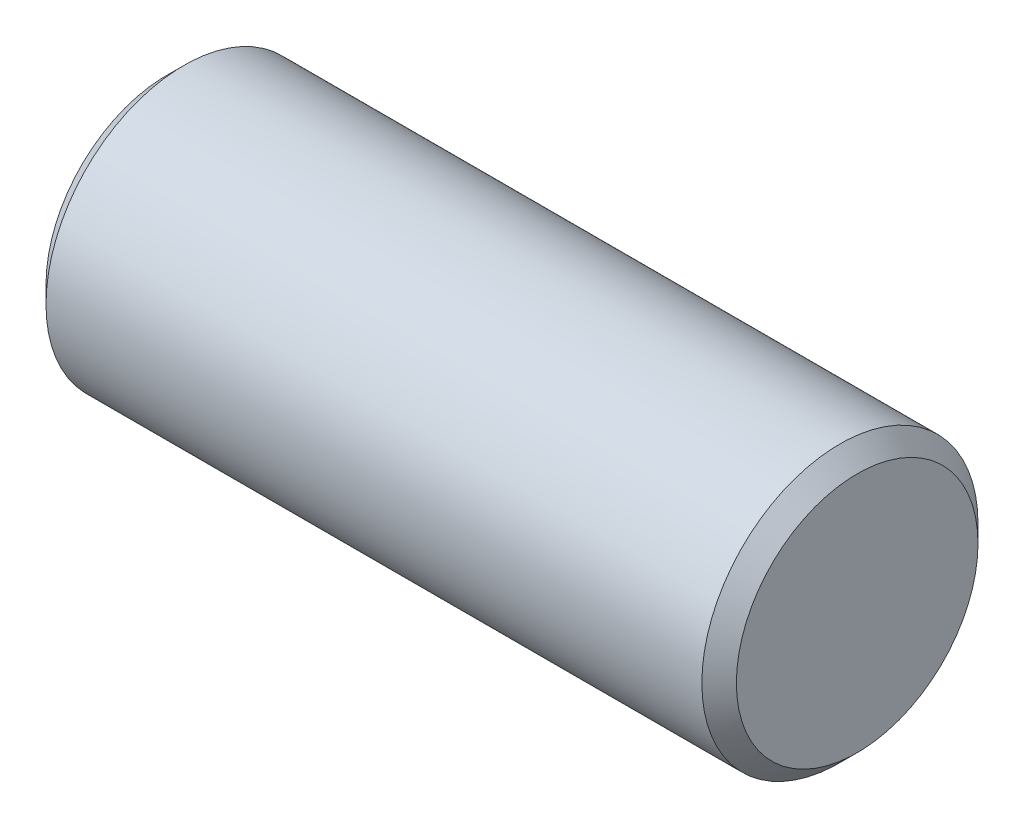
ISO-10303-21;
HEADER;
FILE_DESCRIPTION(('STEP AP214'),'2;1');
FILE_NAME('part.step','',(''),(''),'','','');
FILE_SCHEMA(('AUTOMOTIVE_DESIGN { 1 0 10303 214 1 1 1 1 }'));
ENDSEC;
DATA;
#1=APPLICATION_CONTEXT('core data for automotive mechanical design processes');
#2=APPLICATION_PROTOCOL_DEFINITION('international standard','automotive_design',2000,#1);
#3=PRODUCT_CONTEXT('',#1,'mechanical');
#4=PRODUCT('Part','Part','',(#3));
#5=PRODUCT_RELATED_PRODUCT_CATEGORY('part','',(#4));
#6=PRODUCT_DEFINITION_FORMATION('','',#4);
#7=PRODUCT_DEFINITION_CONTEXT('part definition',#1,'design');
#8=PRODUCT_DEFINITION('design','',#6,#7);
#9=PRODUCT_DEFINITION_SHAPE('','',#8);
#10=(LENGTH_UNIT() NAMED_UNIT(*) SI_UNIT(.MILLI.,.METRE.));
#11=(NAMED_UNIT(*) PLANE_ANGLE_UNIT() SI_UNIT($,.RADIAN.));
#12=(NAMED_UNIT(*) SI_UNIT($,.STERADIAN.) SOLID_ANGLE_UNIT());
#13=UNCERTAINTY_MEASURE_WITH_UNIT(LENGTH_MEASURE(1.E-05),#10,'distance_accuracy_value','');
#14=(GEOMETRIC_REPRESENTATION_CONTEXT(3) GLOBAL_UNCERTAINTY_ASSIGNED_CONTEXT((#13)) GLOBAL_UNIT_ASSIGNED_CONTEXT((#10,
#11,#12)) REPRESENTATION_CONTEXT('',''));
#15=CARTESIAN_POINT('',(0.,0.,0.));
#16=DIRECTION('',(0.,0.,1.));
#17=DIRECTION('',(1.,0.,0.));
#18=AXIS2_PLACEMENT_3D('',#15,#16,#17);
#19=CARTESIAN_POINT('',(0.,4.,0.));
#20=DIRECTION('',(1.,0.,0.));
#21=DIRECTION('',(0.,0.,-1.));
#22=AXIS2_PLACEMENT_3D('',#19,#20,#21);
#23=PLANE('',#22);
#24=CARTESIAN_POINT('',(0.,0.,0.));
#25=DIRECTION('',(1.,0.,0.));
#26=DIRECTION('',(0.,0.,-1.));
#27=AXIS2_PLACEMENT_3D('',#24,#25,#26);
#28=CIRCLE('',#27,3.5);
#29=CARTESIAN_POINT('',(0.,0.,-3.5));
#30=VERTEX_POINT('',#29);
#31=EDGE_CURVE('E47',#30,#30,#28,.F.);
#32=ORIENTED_EDGE('',*,*,#31,.T.);
#33=EDGE_LOOP('',(#32));
#34=FACE_BOUND('',#33,.T.);
#35=ADVANCED_FACE('F32',(#34),#23,.F.);
#36=CARTESIAN_POINT('',(20.,0.,0.));
#37=DIRECTION('',(-1.,0.,0.));
#38=DIRECTION('',(0.,0.,1.));
#39=AXIS2_PLACEMENT_3D('',#36,#37,#38);
#40=PLANE('',#39);
#41=CARTESIAN_POINT('',(20.,0.,0.));
#42=DIRECTION('',(-1.,0.,0.));
#43=DIRECTION('',(0.,0.,1.));
#44=AXIS2_PLACEMENT_3D('',#41,#42,#43);
#45=CIRCLE('',#44,3.49999999999998);
#46=CARTESIAN_POINT('',(20.,0.,3.49999999999998));
#47=VERTEX_POINT('',#46);
#48=EDGE_CURVE('E10',#47,#47,#45,.F.);
#49=ORIENTED_EDGE('',*,*,#48,.T.);
#50=EDGE_LOOP('',(#49));
#51=FACE_BOUND('',#50,.T.);
#52=ADVANCED_FACE('F63',(#51),#40,.F.);
#53=CARTESIAN_POINT('',(0.,0.,0.));
#54=DIRECTION('',(-1.,0.,0.));
#55=DIRECTION('',(0.,0.,1.));
#56=AXIS2_PLACEMENT_3D('',#53,#54,#55);
#57=CYLINDRICAL_SURFACE('',#56,3.99999999999999);
#58=CARTESIAN_POINT('',(0.499999999999992,0.,0.));
#59=DIRECTION('',(1.,0.,0.));
#60=DIRECTION('',(0.,0.,-1.));
#61=AXIS2_PLACEMENT_3D('',#58,#59,#60);
#62=CIRCLE('',#61,3.99999999999999);
#63=CARTESIAN_POINT('',(0.499999999999992,0.,-3.99999999999999));
#64=VERTEX_POINT('',#63);
#65=EDGE_CURVE('E39',#64,#64,#62,.T.);
#66=ORIENTED_EDGE('',*,*,#65,.T.);
#67=EDGE_LOOP('',(#66));
#68=FACE_BOUND('',#67,.T.);
#69=CARTESIAN_POINT('',(19.5,0.,0.));
#70=DIRECTION('',(-1.,0.,0.));
#71=DIRECTION('',(0.,0.,1.));
#72=AXIS2_PLACEMENT_3D('',#69,#70,#71);
#73=CIRCLE('',#72,3.99999999999999);
#74=CARTESIAN_POINT('',(19.5,0.,3.99999999999999));
#75=VERTEX_POINT('',#74);
#76=EDGE_CURVE('E43',#75,#75,#73,.T.);
#77=ORIENTED_EDGE('',*,*,#76,.T.);
#78=EDGE_LOOP('',(#77));
#79=FACE_BOUND('',#78,.T.);
#80=ADVANCED_FACE('F56',(#68,#79),#57,.T.);
#81=CARTESIAN_POINT('',(0.,0.,0.));
#82=DIRECTION('',(1.,0.,0.));
#83=DIRECTION('',(0.,0.,-1.));
#84=AXIS2_PLACEMENT_3D('',#81,#82,#83);
#85=CONICAL_SURFACE('',#84,3.5,0.785398163397445);
#86=ORIENTED_EDGE('',*,*,#65,.F.);
#87=EDGE_LOOP('',(#86));
#88=FACE_BOUND('',#87,.T.);
#89=ORIENTED_EDGE('',*,*,#31,.F.);
#90=EDGE_LOOP('',(#89));
#91=FACE_BOUND('',#90,.T.);
#92=ADVANCED_FACE('F54',(#88,#91),#85,.T.);
#93=CARTESIAN_POINT('',(19.5,0.,0.));
#94=DIRECTION('',(-1.,0.,0.));
#95=DIRECTION('',(0.,0.,1.));
#96=AXIS2_PLACEMENT_3D('',#93,#94,#95);
#97=CONICAL_SURFACE('',#96,3.99999999999999,0.785398163397453);
#98=ORIENTED_EDGE('',*,*,#48,.F.);
#99=EDGE_LOOP('',(#98));
#100=FACE_BOUND('',#99,.T.);
#101=ORIENTED_EDGE('',*,*,#76,.F.);
#102=EDGE_LOOP('',(#101));
#103=FACE_BOUND('',#102,.T.);
#104=ADVANCED_FACE('F34',(#100,#103),#97,.T.);
#105=CLOSED_SHELL('',(#35,#52,#80,#92,#104));
#106=MANIFOLD_SOLID_BREP('B2',#105);
#107=ADVANCED_BREP_SHAPE_REPRESENTATION('',(#18,#106),#14);
#108=SHAPE_DEFINITION_REPRESENTATION(#9,#107);
ENDSEC;
END-ISO-10303-21;
